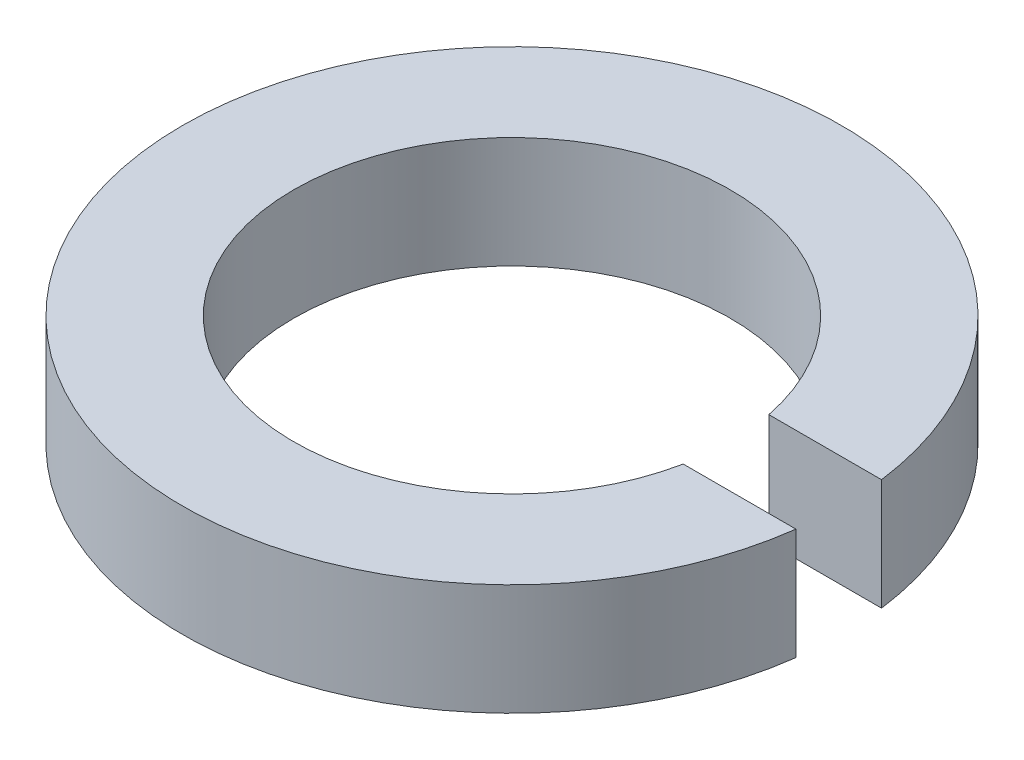
ISO-10303-21;
HEADER;
FILE_DESCRIPTION(('STEP AP214'),'2;1');
FILE_NAME('part.step','',(''),(''),'','','');
FILE_SCHEMA(('AUTOMOTIVE_DESIGN { 1 0 10303 214 1 1 1 1 }'));
ENDSEC;
DATA;
#1=APPLICATION_CONTEXT('core data for automotive mechanical design processes');
#2=APPLICATION_PROTOCOL_DEFINITION('international standard','automotive_design',2000,#1);
#3=PRODUCT_CONTEXT('',#1,'mechanical');
#4=PRODUCT('Part','Part','',(#3));
#5=PRODUCT_RELATED_PRODUCT_CATEGORY('part','',(#4));
#6=PRODUCT_DEFINITION_FORMATION('','',#4);
#7=PRODUCT_DEFINITION_CONTEXT('part definition',#1,'design');
#8=PRODUCT_DEFINITION('design','',#6,#7);
#9=PRODUCT_DEFINITION_SHAPE('','',#8);
#10=(LENGTH_UNIT() NAMED_UNIT(*) SI_UNIT(.MILLI.,.METRE.));
#11=(NAMED_UNIT(*) PLANE_ANGLE_UNIT() SI_UNIT($,.RADIAN.));
#12=(NAMED_UNIT(*) SI_UNIT($,.STERADIAN.) SOLID_ANGLE_UNIT());
#13=UNCERTAINTY_MEASURE_WITH_UNIT(LENGTH_MEASURE(1.E-05),#10,'distance_accuracy_value','');
#14=(GEOMETRIC_REPRESENTATION_CONTEXT(3) GLOBAL_UNCERTAINTY_ASSIGNED_CONTEXT((#13)) GLOBAL_UNIT_ASSIGNED_CONTEXT((#10,
#11,#12)) REPRESENTATION_CONTEXT('',''));
#15=CARTESIAN_POINT('',(0.,0.,0.));
#16=DIRECTION('',(0.,0.,1.));
#17=DIRECTION('',(1.,0.,0.));
#18=AXIS2_PLACEMENT_3D('',#15,#16,#17);
#19=CARTESIAN_POINT('',(0.,2.6,0.));
#20=DIRECTION('',(0.,1.,0.));
#21=DIRECTION('',(0.,0.,1.));
#22=AXIS2_PLACEMENT_3D('',#19,#20,#21);
#23=PLANE('',#22);
#24=DIRECTION('',(-1.,0.,0.));
#25=VECTOR('',#24,1.);
#26=CARTESIAN_POINT('',(0.,2.6,-1.));
#27=LINE('',#26,#25);
#28=CARTESIAN_POINT('',(7.63478879865056,2.6,-1.));
#29=VERTEX_POINT('',#28);
#30=CARTESIAN_POINT('',(5.00099990001999,2.6,-1.));
#31=VERTEX_POINT('',#30);
#32=EDGE_CURVE('E39',#29,#31,#27,.T.);
#33=ORIENTED_EDGE('',*,*,#32,.F.);
#34=CARTESIAN_POINT('',(0.,2.6,0.));
#35=DIRECTION('',(0.,1.,0.));
#36=DIRECTION('',(0.,0.,1.));
#37=AXIS2_PLACEMENT_3D('',#34,#35,#36);
#38=CIRCLE('',#37,7.7);
#39=CARTESIAN_POINT('',(7.63478879865056,2.6,1.));
#40=VERTEX_POINT('',#39);
#41=EDGE_CURVE('E62',#29,#40,#38,.T.);
#42=ORIENTED_EDGE('',*,*,#41,.T.);
#43=DIRECTION('',(1.,0.,0.));
#44=VECTOR('',#43,1.);
#45=CARTESIAN_POINT('',(0.,2.6,1.));
#46=LINE('',#45,#44);
#47=CARTESIAN_POINT('',(5.00099990001999,2.6,1.));
#48=VERTEX_POINT('',#47);
#49=EDGE_CURVE('E56',#48,#40,#46,.T.);
#50=ORIENTED_EDGE('',*,*,#49,.F.);
#51=CARTESIAN_POINT('',(0.,2.6,0.));
#52=DIRECTION('',(0.,1.,0.));
#53=DIRECTION('',(0.,0.,1.));
#54=AXIS2_PLACEMENT_3D('',#51,#52,#53);
#55=CIRCLE('',#54,5.1);
#56=EDGE_CURVE('E66',#31,#48,#55,.T.);
#57=ORIENTED_EDGE('',*,*,#56,.F.);
#58=EDGE_LOOP('',(#33,#42,#50,#57));
#59=FACE_BOUND('',#58,.T.);
#60=ADVANCED_FACE('F17',(#59),#23,.T.);
#61=CARTESIAN_POINT('',(0.,0.,0.));
#62=DIRECTION('',(0.,1.,0.));
#63=DIRECTION('',(0.,0.,1.));
#64=AXIS2_PLACEMENT_3D('',#61,#62,#63);
#65=PLANE('',#64);
#66=CARTESIAN_POINT('',(0.,0.,0.));
#67=DIRECTION('',(0.,1.,0.));
#68=DIRECTION('',(0.,0.,1.));
#69=AXIS2_PLACEMENT_3D('',#66,#67,#68);
#70=CIRCLE('',#69,7.7);
#71=CARTESIAN_POINT('',(7.63478879865056,0.,-1.));
#72=VERTEX_POINT('',#71);
#73=CARTESIAN_POINT('',(7.63478879865056,0.,1.));
#74=VERTEX_POINT('',#73);
#75=EDGE_CURVE('E70',#72,#74,#70,.T.);
#76=ORIENTED_EDGE('',*,*,#75,.F.);
#77=DIRECTION('',(-1.,0.,0.));
#78=VECTOR('',#77,1.);
#79=CARTESIAN_POINT('',(0.,0.,-1.));
#80=LINE('',#79,#78);
#81=CARTESIAN_POINT('',(5.00099990001999,0.,-1.));
#82=VERTEX_POINT('',#81);
#83=EDGE_CURVE('E83',#72,#82,#80,.T.);
#84=ORIENTED_EDGE('',*,*,#83,.T.);
#85=CARTESIAN_POINT('',(0.,0.,0.));
#86=DIRECTION('',(0.,1.,0.));
#87=DIRECTION('',(0.,0.,1.));
#88=AXIS2_PLACEMENT_3D('',#85,#86,#87);
#89=CIRCLE('',#88,5.1);
#90=CARTESIAN_POINT('',(5.00099990001999,0.,1.));
#91=VERTEX_POINT('',#90);
#92=EDGE_CURVE('E71',#82,#91,#89,.T.);
#93=ORIENTED_EDGE('',*,*,#92,.T.);
#94=DIRECTION('',(1.,0.,0.));
#95=VECTOR('',#94,1.);
#96=CARTESIAN_POINT('',(0.,0.,1.));
#97=LINE('',#96,#95);
#98=EDGE_CURVE('E32',#91,#74,#97,.T.);
#99=ORIENTED_EDGE('',*,*,#98,.T.);
#100=EDGE_LOOP('',(#76,#84,#93,#99));
#101=FACE_BOUND('',#100,.T.);
#102=ADVANCED_FACE('F89',(#101),#65,.F.);
#103=CARTESIAN_POINT('',(0.,2.6,0.));
#104=DIRECTION('',(0.,-1.,0.));
#105=DIRECTION('',(0.,0.,-1.));
#106=AXIS2_PLACEMENT_3D('',#103,#104,#105);
#107=CYLINDRICAL_SURFACE('',#106,7.7);
#108=ORIENTED_EDGE('',*,*,#41,.F.);
#109=DIRECTION('',(0.,-1.,0.));
#110=VECTOR('',#109,1.);
#111=CARTESIAN_POINT('',(7.63478879865056,2.6,-1.));
#112=LINE('',#111,#110);
#113=EDGE_CURVE('E75',#29,#72,#112,.T.);
#114=ORIENTED_EDGE('',*,*,#113,.T.);
#115=ORIENTED_EDGE('',*,*,#75,.T.);
#116=DIRECTION('',(0.,-1.,0.));
#117=VECTOR('',#116,1.);
#118=CARTESIAN_POINT('',(7.63478879865056,2.6,1.));
#119=LINE('',#118,#117);
#120=EDGE_CURVE('E81',#74,#40,#119,.F.);
#121=ORIENTED_EDGE('',*,*,#120,.T.);
#122=EDGE_LOOP('',(#108,#114,#115,#121));
#123=FACE_BOUND('',#122,.T.);
#124=ADVANCED_FACE('F19',(#123),#107,.T.);
#125=CARTESIAN_POINT('',(0.,2.6,0.));
#126=DIRECTION('',(0.,-1.,0.));
#127=DIRECTION('',(0.,0.,-1.));
#128=AXIS2_PLACEMENT_3D('',#125,#126,#127);
#129=CYLINDRICAL_SURFACE('',#128,5.1);
#130=DIRECTION('',(0.,-1.,0.));
#131=VECTOR('',#130,1.);
#132=CARTESIAN_POINT('',(5.00099990001999,2.6,-1.));
#133=LINE('',#132,#131);
#134=EDGE_CURVE('E11',#31,#82,#133,.T.);
#135=ORIENTED_EDGE('',*,*,#134,.F.);
#136=ORIENTED_EDGE('',*,*,#56,.T.);
#137=DIRECTION('',(0.,-1.,0.));
#138=VECTOR('',#137,1.);
#139=CARTESIAN_POINT('',(5.00099990001999,2.6,1.));
#140=LINE('',#139,#138);
#141=EDGE_CURVE('E25',#91,#48,#140,.F.);
#142=ORIENTED_EDGE('',*,*,#141,.F.);
#143=ORIENTED_EDGE('',*,*,#92,.F.);
#144=EDGE_LOOP('',(#135,#136,#142,#143));
#145=FACE_BOUND('',#144,.T.);
#146=ADVANCED_FACE('F69',(#145),#129,.F.);
#147=CARTESIAN_POINT('',(0.,0.,1.));
#148=DIRECTION('',(0.,0.,1.));
#149=DIRECTION('',(1.,0.,0.));
#150=AXIS2_PLACEMENT_3D('',#147,#148,#149);
#151=PLANE('',#150);
#152=ORIENTED_EDGE('',*,*,#98,.F.);
#153=ORIENTED_EDGE('',*,*,#141,.T.);
#154=ORIENTED_EDGE('',*,*,#49,.T.);
#155=ORIENTED_EDGE('',*,*,#120,.F.);
#156=EDGE_LOOP('',(#152,#153,#154,#155));
#157=FACE_BOUND('',#156,.T.);
#158=ADVANCED_FACE('F55',(#157),#151,.F.);
#159=CARTESIAN_POINT('',(0.,0.,-1.));
#160=DIRECTION('',(0.,0.,-1.));
#161=DIRECTION('',(-1.,0.,0.));
#162=AXIS2_PLACEMENT_3D('',#159,#160,#161);
#163=PLANE('',#162);
#164=ORIENTED_EDGE('',*,*,#32,.T.);
#165=ORIENTED_EDGE('',*,*,#134,.T.);
#166=ORIENTED_EDGE('',*,*,#83,.F.);
#167=ORIENTED_EDGE('',*,*,#113,.F.);
#168=EDGE_LOOP('',(#164,#165,#166,#167));
#169=FACE_BOUND('',#168,.T.);
#170=ADVANCED_FACE('F91',(#169),#163,.F.);
#171=CLOSED_SHELL('',(#60,#102,#124,#146,#158,#170));
#172=MANIFOLD_SOLID_BREP('B1',#171);
#173=ADVANCED_BREP_SHAPE_REPRESENTATION('',(#18,#172),#14);
#174=SHAPE_DEFINITION_REPRESENTATION(#9,#173);
ENDSEC;
END-ISO-10303-21;
